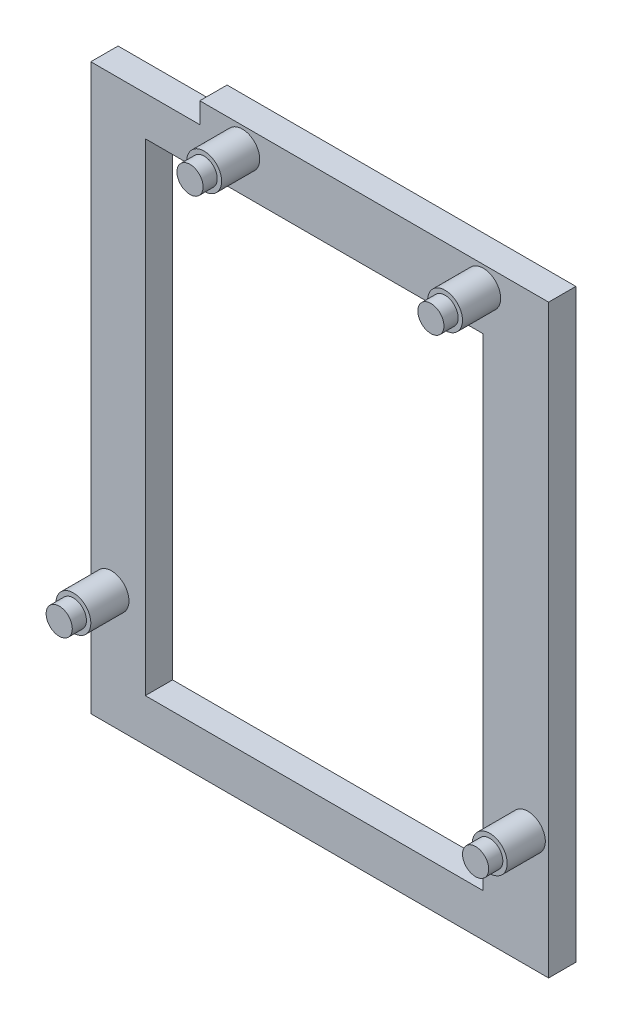
ISO-10303-21;
HEADER;
FILE_DESCRIPTION(('STEP AP214'),'2;1');
FILE_NAME('part.step','',(''),(''),'','','');
FILE_SCHEMA(('AUTOMOTIVE_DESIGN { 1 0 10303 214 1 1 1 1 }'));
ENDSEC;
DATA;
#1=APPLICATION_CONTEXT('core data for automotive mechanical design processes');
#2=APPLICATION_PROTOCOL_DEFINITION('international standard','automotive_design',2000,#1);
#3=PRODUCT_CONTEXT('',#1,'mechanical');
#4=PRODUCT('Part','Part','',(#3));
#5=PRODUCT_RELATED_PRODUCT_CATEGORY('part','',(#4));
#6=PRODUCT_DEFINITION_FORMATION('','',#4);
#7=PRODUCT_DEFINITION_CONTEXT('part definition',#1,'design');
#8=PRODUCT_DEFINITION('design','',#6,#7);
#9=PRODUCT_DEFINITION_SHAPE('','',#8);
#10=(LENGTH_UNIT() NAMED_UNIT(*) SI_UNIT(.MILLI.,.METRE.));
#11=(NAMED_UNIT(*) PLANE_ANGLE_UNIT() SI_UNIT($,.RADIAN.));
#12=(NAMED_UNIT(*) SI_UNIT($,.STERADIAN.) SOLID_ANGLE_UNIT());
#13=UNCERTAINTY_MEASURE_WITH_UNIT(LENGTH_MEASURE(1.E-05),#10,'distance_accuracy_value','');
#14=(GEOMETRIC_REPRESENTATION_CONTEXT(3) GLOBAL_UNCERTAINTY_ASSIGNED_CONTEXT((#13)) GLOBAL_UNIT_ASSIGNED_CONTEXT((#10,
#11,#12)) REPRESENTATION_CONTEXT('',''));
#15=CARTESIAN_POINT('',(0.,0.,0.));
#16=DIRECTION('',(0.,0.,1.));
#17=DIRECTION('',(1.,0.,0.));
#18=AXIS2_PLACEMENT_3D('',#15,#16,#17);
#19=CARTESIAN_POINT('',(45.72,-33.3860882647751,3.175));
#20=DIRECTION('',(1.,0.,0.));
#21=DIRECTION('',(0.,0.,-1.));
#22=AXIS2_PLACEMENT_3D('',#19,#20,#21);
#23=PLANE('',#22);
#24=DIRECTION('',(0.,-1.,0.));
#25=VECTOR('',#24,1.);
#26=CARTESIAN_POINT('',(45.72,-33.3860882647751,0.));
#27=LINE('',#26,#25);
#28=CARTESIAN_POINT('',(45.72,61.1908522999428,0.));
#29=VERTEX_POINT('',#28);
#30=CARTESIAN_POINT('',(45.72,4.99653440010306,0.));
#31=VERTEX_POINT('',#30);
#32=EDGE_CURVE('E153',#29,#31,#27,.T.);
#33=ORIENTED_EDGE('',*,*,#32,.T.);
#34=DIRECTION('',(0.,0.,-1.));
#35=VECTOR('',#34,1.);
#36=CARTESIAN_POINT('',(45.72,4.99653440010306,3.175));
#37=LINE('',#36,#35);
#38=CARTESIAN_POINT('',(45.72,4.99653440010306,3.175));
#39=VERTEX_POINT('',#38);
#40=EDGE_CURVE('E88',#39,#31,#37,.T.);
#41=ORIENTED_EDGE('',*,*,#40,.F.);
#42=DIRECTION('',(0.,-1.,0.));
#43=VECTOR('',#42,1.);
#44=CARTESIAN_POINT('',(45.72,-33.3860882647751,3.175));
#45=LINE('',#44,#43);
#46=CARTESIAN_POINT('',(45.72,61.1908522999428,3.175));
#47=VERTEX_POINT('',#46);
#48=EDGE_CURVE('E53',#47,#39,#45,.T.);
#49=ORIENTED_EDGE('',*,*,#48,.F.);
#50=DIRECTION('',(0.,0.,1.));
#51=VECTOR('',#50,1.);
#52=CARTESIAN_POINT('',(45.72,61.1908522999428,-6.096));
#53=LINE('',#52,#51);
#54=EDGE_CURVE('E190',#29,#47,#53,.T.);
#55=ORIENTED_EDGE('',*,*,#54,.F.);
#56=EDGE_LOOP('',(#33,#41,#49,#55));
#57=FACE_BOUND('',#56,.T.);
#58=ADVANCED_FACE('F36',(#57),#23,.F.);
#59=CARTESIAN_POINT('',(26.67,4.99653440010306,3.175));
#60=DIRECTION('',(0.,1.,0.));
#61=DIRECTION('',(0.,0.,1.));
#62=AXIS2_PLACEMENT_3D('',#59,#60,#61);
#63=PLANE('',#62);
#64=DIRECTION('',(1.,0.,0.));
#65=VECTOR('',#64,1.);
#66=CARTESIAN_POINT('',(26.67,4.99653440010306,0.));
#67=LINE('',#66,#65);
#68=CARTESIAN_POINT('',(6.35,4.99653440010306,0.));
#69=VERTEX_POINT('',#68);
#70=EDGE_CURVE('E155',#69,#31,#67,.T.);
#71=ORIENTED_EDGE('',*,*,#70,.F.);
#72=DIRECTION('',(0.,0.,1.));
#73=VECTOR('',#72,1.);
#74=CARTESIAN_POINT('',(6.35,4.99653440010306,-6.096));
#75=LINE('',#74,#73);
#76=CARTESIAN_POINT('',(6.35,4.99653440010306,3.175));
#77=VERTEX_POINT('',#76);
#78=EDGE_CURVE('E179',#69,#77,#75,.T.);
#79=ORIENTED_EDGE('',*,*,#78,.T.);
#80=DIRECTION('',(1.,0.,0.));
#81=VECTOR('',#80,1.);
#82=CARTESIAN_POINT('',(26.67,4.99653440010306,3.175));
#83=LINE('',#82,#81);
#84=EDGE_CURVE('E135',#77,#39,#83,.T.);
#85=ORIENTED_EDGE('',*,*,#84,.T.);
#86=ORIENTED_EDGE('',*,*,#40,.T.);
#87=EDGE_LOOP('',(#71,#79,#85,#86));
#88=FACE_BOUND('',#87,.T.);
#89=ADVANCED_FACE('F261',(#88),#63,.T.);
#90=CARTESIAN_POINT('',(53.34,-33.3860882647751,3.175));
#91=DIRECTION('',(1.,0.,0.));
#92=DIRECTION('',(0.,0.,-1.));
#93=AXIS2_PLACEMENT_3D('',#90,#91,#92);
#94=PLANE('',#93);
#95=DIRECTION('',(0.,-1.,0.));
#96=VECTOR('',#95,1.);
#97=CARTESIAN_POINT('',(53.34,-33.3860882647751,0.));
#98=LINE('',#97,#96);
#99=CARTESIAN_POINT('',(53.34,68.199,0.));
#100=VERTEX_POINT('',#99);
#101=CARTESIAN_POINT('',(53.34,0.,0.));
#102=VERTEX_POINT('',#101);
#103=EDGE_CURVE('E137',#100,#102,#98,.T.);
#104=ORIENTED_EDGE('',*,*,#103,.F.);
#105=DIRECTION('',(0.,0.,-1.));
#106=VECTOR('',#105,1.);
#107=CARTESIAN_POINT('',(53.34,68.199,3.175));
#108=LINE('',#107,#106);
#109=CARTESIAN_POINT('',(53.34,68.199,3.175));
#110=VERTEX_POINT('',#109);
#111=EDGE_CURVE('E93',#110,#100,#108,.T.);
#112=ORIENTED_EDGE('',*,*,#111,.F.);
#113=DIRECTION('',(0.,-1.,0.));
#114=VECTOR('',#113,1.);
#115=CARTESIAN_POINT('',(53.34,-33.3860882647751,3.175));
#116=LINE('',#115,#114);
#117=CARTESIAN_POINT('',(53.34,0.,3.175));
#118=VERTEX_POINT('',#117);
#119=EDGE_CURVE('E245',#110,#118,#116,.T.);
#120=ORIENTED_EDGE('',*,*,#119,.T.);
#121=DIRECTION('',(0.,0.,-1.));
#122=VECTOR('',#121,1.);
#123=CARTESIAN_POINT('',(53.34,0.,3.175));
#124=LINE('',#123,#122);
#125=EDGE_CURVE('E81',#118,#102,#124,.T.);
#126=ORIENTED_EDGE('',*,*,#125,.T.);
#127=EDGE_LOOP('',(#104,#112,#120,#126));
#128=FACE_BOUND('',#127,.T.);
#129=ADVANCED_FACE('F38',(#128),#94,.T.);
#130=CARTESIAN_POINT('',(26.67,68.199,3.175));
#131=DIRECTION('',(0.,1.,0.));
#132=DIRECTION('',(0.,0.,1.));
#133=AXIS2_PLACEMENT_3D('',#130,#131,#132);
#134=PLANE('',#133);
#135=DIRECTION('',(1.,0.,0.));
#136=VECTOR('',#135,1.);
#137=CARTESIAN_POINT('',(26.67,68.199,0.));
#138=LINE('',#137,#136);
#139=CARTESIAN_POINT('',(12.7,68.199,0.));
#140=VERTEX_POINT('',#139);
#141=EDGE_CURVE('E140',#140,#100,#138,.T.);
#142=ORIENTED_EDGE('',*,*,#141,.F.);
#143=DIRECTION('',(0.,0.,-1.));
#144=VECTOR('',#143,1.);
#145=CARTESIAN_POINT('',(12.7,68.199,3.175));
#146=LINE('',#145,#144);
#147=CARTESIAN_POINT('',(12.7,68.199,3.175));
#148=VERTEX_POINT('',#147);
#149=EDGE_CURVE('E164',#148,#140,#146,.T.);
#150=ORIENTED_EDGE('',*,*,#149,.F.);
#151=DIRECTION('',(1.,0.,0.));
#152=VECTOR('',#151,1.);
#153=CARTESIAN_POINT('',(26.67,68.199,3.175));
#154=LINE('',#153,#152);
#155=EDGE_CURVE('E247',#148,#110,#154,.T.);
#156=ORIENTED_EDGE('',*,*,#155,.T.);
#157=ORIENTED_EDGE('',*,*,#111,.T.);
#158=EDGE_LOOP('',(#142,#150,#156,#157));
#159=FACE_BOUND('',#158,.T.);
#160=ADVANCED_FACE('F260',(#159),#134,.T.);
#161=CARTESIAN_POINT('',(12.7,-33.3860882647751,3.175));
#162=DIRECTION('',(-1.,0.,0.));
#163=DIRECTION('',(0.,0.,1.));
#164=AXIS2_PLACEMENT_3D('',#161,#162,#163);
#165=PLANE('',#164);
#166=DIRECTION('',(0.,1.,0.));
#167=VECTOR('',#166,1.);
#168=CARTESIAN_POINT('',(12.7,-33.3860882647751,0.));
#169=LINE('',#168,#167);
#170=CARTESIAN_POINT('',(12.7,65.786,0.));
#171=VERTEX_POINT('',#170);
#172=EDGE_CURVE('E144',#171,#140,#169,.T.);
#173=ORIENTED_EDGE('',*,*,#172,.F.);
#174=DIRECTION('',(0.,0.,-1.));
#175=VECTOR('',#174,1.);
#176=CARTESIAN_POINT('',(12.7,65.786,3.175));
#177=LINE('',#176,#175);
#178=CARTESIAN_POINT('',(12.7,65.786,3.175));
#179=VERTEX_POINT('',#178);
#180=EDGE_CURVE('E162',#179,#171,#177,.T.);
#181=ORIENTED_EDGE('',*,*,#180,.F.);
#182=DIRECTION('',(0.,1.,0.));
#183=VECTOR('',#182,1.);
#184=CARTESIAN_POINT('',(12.7,-33.3860882647751,3.175));
#185=LINE('',#184,#183);
#186=EDGE_CURVE('E130',#179,#148,#185,.T.);
#187=ORIENTED_EDGE('',*,*,#186,.T.);
#188=ORIENTED_EDGE('',*,*,#149,.T.);
#189=EDGE_LOOP('',(#173,#181,#187,#188));
#190=FACE_BOUND('',#189,.T.);
#191=ADVANCED_FACE('F252',(#190),#165,.T.);
#192=CARTESIAN_POINT('',(26.67,65.786,3.175));
#193=DIRECTION('',(0.,1.,0.));
#194=DIRECTION('',(0.,0.,1.));
#195=AXIS2_PLACEMENT_3D('',#192,#193,#194);
#196=PLANE('',#195);
#197=DIRECTION('',(1.,0.,0.));
#198=VECTOR('',#197,1.);
#199=CARTESIAN_POINT('',(26.67,65.786,0.));
#200=LINE('',#199,#198);
#201=CARTESIAN_POINT('',(0.,65.786,0.));
#202=VERTEX_POINT('',#201);
#203=EDGE_CURVE('E147',#202,#171,#200,.T.);
#204=ORIENTED_EDGE('',*,*,#203,.F.);
#205=DIRECTION('',(0.,0.,-1.));
#206=VECTOR('',#205,1.);
#207=CARTESIAN_POINT('',(0.,65.786,3.175));
#208=LINE('',#207,#206);
#209=CARTESIAN_POINT('',(0.,65.786,3.175));
#210=VERTEX_POINT('',#209);
#211=EDGE_CURVE('E118',#210,#202,#208,.T.);
#212=ORIENTED_EDGE('',*,*,#211,.F.);
#213=DIRECTION('',(1.,0.,0.));
#214=VECTOR('',#213,1.);
#215=CARTESIAN_POINT('',(26.67,65.786,3.175));
#216=LINE('',#215,#214);
#217=EDGE_CURVE('E128',#210,#179,#216,.T.);
#218=ORIENTED_EDGE('',*,*,#217,.T.);
#219=ORIENTED_EDGE('',*,*,#180,.T.);
#220=EDGE_LOOP('',(#204,#212,#218,#219));
#221=FACE_BOUND('',#220,.T.);
#222=ADVANCED_FACE('F257',(#221),#196,.T.);
#223=CARTESIAN_POINT('',(0.,-33.3860882647751,3.175));
#224=DIRECTION('',(-1.,0.,0.));
#225=DIRECTION('',(0.,0.,1.));
#226=AXIS2_PLACEMENT_3D('',#223,#224,#225);
#227=PLANE('',#226);
#228=DIRECTION('',(0.,1.,0.));
#229=VECTOR('',#228,1.);
#230=CARTESIAN_POINT('',(0.,-33.3860882647751,0.));
#231=LINE('',#230,#229);
#232=CARTESIAN_POINT('',(0.,0.,0.));
#233=VERTEX_POINT('',#232);
#234=EDGE_CURVE('E115',#233,#202,#231,.T.);
#235=ORIENTED_EDGE('',*,*,#234,.F.);
#236=DIRECTION('',(0.,0.,-1.));
#237=VECTOR('',#236,1.);
#238=CARTESIAN_POINT('',(0.,0.,3.175));
#239=LINE('',#238,#237);
#240=CARTESIAN_POINT('',(0.,0.,3.175));
#241=VERTEX_POINT('',#240);
#242=EDGE_CURVE('E109',#241,#233,#239,.T.);
#243=ORIENTED_EDGE('',*,*,#242,.F.);
#244=DIRECTION('',(0.,1.,0.));
#245=VECTOR('',#244,1.);
#246=CARTESIAN_POINT('',(0.,-33.3860882647751,3.175));
#247=LINE('',#246,#245);
#248=EDGE_CURVE('E113',#241,#210,#247,.T.);
#249=ORIENTED_EDGE('',*,*,#248,.T.);
#250=ORIENTED_EDGE('',*,*,#211,.T.);
#251=EDGE_LOOP('',(#235,#243,#249,#250));
#252=FACE_BOUND('',#251,.T.);
#253=ADVANCED_FACE('F111',(#252),#227,.T.);
#254=CARTESIAN_POINT('',(26.67,0.,3.175));
#255=DIRECTION('',(0.,1.,0.));
#256=DIRECTION('',(0.,0.,1.));
#257=AXIS2_PLACEMENT_3D('',#254,#255,#256);
#258=PLANE('',#257);
#259=DIRECTION('',(1.,0.,0.));
#260=VECTOR('',#259,1.);
#261=CARTESIAN_POINT('',(26.67,0.,0.));
#262=LINE('',#261,#260);
#263=EDGE_CURVE('E151',#233,#102,#262,.T.);
#264=ORIENTED_EDGE('',*,*,#263,.T.);
#265=ORIENTED_EDGE('',*,*,#125,.F.);
#266=DIRECTION('',(1.,0.,0.));
#267=VECTOR('',#266,1.);
#268=CARTESIAN_POINT('',(26.67,0.,3.175));
#269=LINE('',#268,#267);
#270=EDGE_CURVE('E120',#241,#118,#269,.T.);
#271=ORIENTED_EDGE('',*,*,#270,.F.);
#272=ORIENTED_EDGE('',*,*,#242,.T.);
#273=EDGE_LOOP('',(#264,#265,#271,#272));
#274=FACE_BOUND('',#273,.T.);
#275=ADVANCED_FACE('F121',(#274),#258,.F.);
#276=CARTESIAN_POINT('',(26.67,-33.3860882647751,3.175));
#277=DIRECTION('',(0.,0.,1.));
#278=DIRECTION('',(1.,0.,0.));
#279=AXIS2_PLACEMENT_3D('',#276,#277,#278);
#280=PLANE('',#279);
#281=DIRECTION('',(-1.,0.,0.));
#282=VECTOR('',#281,1.);
#283=CARTESIAN_POINT('',(26.67,61.1908522999428,3.175));
#284=LINE('',#283,#282);
#285=CARTESIAN_POINT('',(6.35,61.1908522999428,3.175));
#286=VERTEX_POINT('',#285);
#287=EDGE_CURVE('E187',#47,#286,#284,.T.);
#288=ORIENTED_EDGE('',*,*,#287,.F.);
#289=ORIENTED_EDGE('',*,*,#48,.T.);
#290=ORIENTED_EDGE('',*,*,#84,.F.);
#291=DIRECTION('',(0.,1.,0.));
#292=VECTOR('',#291,1.);
#293=CARTESIAN_POINT('',(6.35,-33.3860882647751,3.175));
#294=LINE('',#293,#292);
#295=EDGE_CURVE('E587',#77,#286,#294,.T.);
#296=ORIENTED_EDGE('',*,*,#295,.T.);
#297=EDGE_LOOP('',(#288,#289,#290,#296));
#298=FACE_BOUND('',#297,.T.);
#299=CARTESIAN_POINT('',(45.72,65.786,3.175));
#300=DIRECTION('',(0.,0.,1.));
#301=DIRECTION('',(1.,0.,0.));
#302=AXIS2_PLACEMENT_3D('',#299,#300,#301);
#303=CIRCLE('',#302,2.032);
#304=CARTESIAN_POINT('',(43.688,65.786,3.175));
#305=VERTEX_POINT('',#304);
#306=EDGE_CURVE('E158',#305,#305,#303,.T.);
#307=ORIENTED_EDGE('',*,*,#306,.F.);
#308=EDGE_LOOP('',(#307));
#309=FACE_BOUND('',#308,.T.);
#310=CARTESIAN_POINT('',(17.653,65.786,3.175));
#311=DIRECTION('',(0.,0.,1.));
#312=DIRECTION('',(1.,0.,0.));
#313=AXIS2_PLACEMENT_3D('',#310,#311,#312);
#314=CIRCLE('',#313,2.032);
#315=CARTESIAN_POINT('',(15.621,65.786,3.175));
#316=VERTEX_POINT('',#315);
#317=EDGE_CURVE('E236',#316,#316,#314,.T.);
#318=ORIENTED_EDGE('',*,*,#317,.F.);
#319=EDGE_LOOP('',(#318));
#320=FACE_BOUND('',#319,.T.);
#321=CARTESIAN_POINT('',(2.413,13.589,3.175));
#322=DIRECTION('',(0.,0.,1.));
#323=DIRECTION('',(1.,0.,0.));
#324=AXIS2_PLACEMENT_3D('',#321,#322,#323);
#325=CIRCLE('',#324,2.032);
#326=CARTESIAN_POINT('',(0.381,13.589,3.175));
#327=VERTEX_POINT('',#326);
#328=EDGE_CURVE('E239',#327,#327,#325,.T.);
#329=ORIENTED_EDGE('',*,*,#328,.F.);
#330=EDGE_LOOP('',(#329));
#331=FACE_BOUND('',#330,.T.);
#332=CARTESIAN_POINT('',(50.927,13.589,3.175));
#333=DIRECTION('',(0.,0.,1.));
#334=DIRECTION('',(1.,0.,0.));
#335=AXIS2_PLACEMENT_3D('',#332,#333,#334);
#336=CIRCLE('',#335,2.032);
#337=CARTESIAN_POINT('',(48.895,13.589,3.175));
#338=VERTEX_POINT('',#337);
#339=EDGE_CURVE('E242',#338,#338,#336,.T.);
#340=ORIENTED_EDGE('',*,*,#339,.F.);
#341=EDGE_LOOP('',(#340));
#342=FACE_BOUND('',#341,.T.);
#343=ORIENTED_EDGE('',*,*,#119,.F.);
#344=ORIENTED_EDGE('',*,*,#155,.F.);
#345=ORIENTED_EDGE('',*,*,#186,.F.);
#346=ORIENTED_EDGE('',*,*,#217,.F.);
#347=ORIENTED_EDGE('',*,*,#248,.F.);
#348=ORIENTED_EDGE('',*,*,#270,.T.);
#349=EDGE_LOOP('',(#343,#344,#345,#346,#347,#348));
#350=FACE_BOUND('',#349,.T.);
#351=ADVANCED_FACE('F125',(#298,#309,#320,#331,#342,#350),#280,.T.);
#352=CARTESIAN_POINT('',(26.67,-33.3860882647751,0.));
#353=DIRECTION('',(0.,0.,1.));
#354=DIRECTION('',(1.,0.,0.));
#355=AXIS2_PLACEMENT_3D('',#352,#353,#354);
#356=PLANE('',#355);
#357=ORIENTED_EDGE('',*,*,#103,.T.);
#358=ORIENTED_EDGE('',*,*,#263,.F.);
#359=ORIENTED_EDGE('',*,*,#234,.T.);
#360=ORIENTED_EDGE('',*,*,#203,.T.);
#361=ORIENTED_EDGE('',*,*,#172,.T.);
#362=ORIENTED_EDGE('',*,*,#141,.T.);
#363=EDGE_LOOP('',(#357,#358,#359,#360,#361,#362));
#364=FACE_BOUND('',#363,.T.);
#365=ORIENTED_EDGE('',*,*,#32,.F.);
#366=DIRECTION('',(-1.,0.,0.));
#367=VECTOR('',#366,1.);
#368=CARTESIAN_POINT('',(26.67,61.1908522999428,0.));
#369=LINE('',#368,#367);
#370=CARTESIAN_POINT('',(6.35,61.1908522999428,0.));
#371=VERTEX_POINT('',#370);
#372=EDGE_CURVE('E11',#29,#371,#369,.T.);
#373=ORIENTED_EDGE('',*,*,#372,.T.);
#374=DIRECTION('',(0.,1.,0.));
#375=VECTOR('',#374,1.);
#376=CARTESIAN_POINT('',(6.35,-33.3860882647751,0.));
#377=LINE('',#376,#375);
#378=EDGE_CURVE('E45',#69,#371,#377,.T.);
#379=ORIENTED_EDGE('',*,*,#378,.F.);
#380=ORIENTED_EDGE('',*,*,#70,.T.);
#381=EDGE_LOOP('',(#365,#373,#379,#380));
#382=FACE_BOUND('',#381,.T.);
#383=ADVANCED_FACE('F193',(#364,#382),#356,.F.);
#384=CARTESIAN_POINT('',(17.653,65.786,7.62));
#385=DIRECTION('',(0.,0.,-1.));
#386=DIRECTION('',(-1.,0.,0.));
#387=AXIS2_PLACEMENT_3D('',#384,#385,#386);
#388=CYLINDRICAL_SURFACE('',#387,2.032);
#389=CARTESIAN_POINT('',(17.653,65.786,7.62));
#390=DIRECTION('',(0.,0.,1.));
#391=DIRECTION('',(1.,0.,0.));
#392=AXIS2_PLACEMENT_3D('',#389,#390,#391);
#393=CIRCLE('',#392,2.032);
#394=CARTESIAN_POINT('',(15.621,65.786,7.62));
#395=VERTEX_POINT('',#394);
#396=EDGE_CURVE('E141',#395,#395,#393,.T.);
#397=CARTESIAN_POINT('',(15.621,65.786,3.175));
#398=CARTESIAN_POINT('',(15.621,65.786,3.22130208333333));
#399=CARTESIAN_POINT('',(15.621,65.786,3.26760416666667));
#400=CARTESIAN_POINT('',(15.621,65.786,3.36020833333333));
#401=CARTESIAN_POINT('',(15.621,65.786,3.40651041666667));
#402=CARTESIAN_POINT('',(15.621,65.786,3.49911458333333));
#403=CARTESIAN_POINT('',(15.621,65.786,3.54541666666667));
#404=CARTESIAN_POINT('',(15.621,65.786,3.63802083333333));
#405=CARTESIAN_POINT('',(15.621,65.786,3.68432291666667));
#406=CARTESIAN_POINT('',(15.621,65.786,3.77692708333333));
#407=CARTESIAN_POINT('',(15.621,65.786,3.82322916666667));
#408=CARTESIAN_POINT('',(15.621,65.786,3.91583333333333));
#409=CARTESIAN_POINT('',(15.621,65.786,3.96213541666667));
#410=CARTESIAN_POINT('',(15.621,65.786,4.05473958333333));
#411=CARTESIAN_POINT('',(15.621,65.786,4.10104166666667));
#412=CARTESIAN_POINT('',(15.621,65.786,4.19364583333333));
#413=CARTESIAN_POINT('',(15.621,65.786,4.23994791666667));
#414=CARTESIAN_POINT('',(15.621,65.786,4.33255208333333));
#415=CARTESIAN_POINT('',(15.621,65.786,4.37885416666667));
#416=CARTESIAN_POINT('',(15.621,65.786,4.47145833333333));
#417=CARTESIAN_POINT('',(15.621,65.786,4.51776041666667));
#418=CARTESIAN_POINT('',(15.621,65.786,4.61036458333333));
#419=CARTESIAN_POINT('',(15.621,65.786,4.65666666666666));
#420=CARTESIAN_POINT('',(15.621,65.786,4.74927083333333));
#421=CARTESIAN_POINT('',(15.621,65.786,4.79557291666667));
#422=CARTESIAN_POINT('',(15.621,65.786,4.88817708333333));
#423=CARTESIAN_POINT('',(15.621,65.786,4.93447916666666));
#424=CARTESIAN_POINT('',(15.621,65.786,5.02708333333333));
#425=CARTESIAN_POINT('',(15.621,65.786,5.07338541666667));
#426=CARTESIAN_POINT('',(15.621,65.786,5.16598958333333));
#427=CARTESIAN_POINT('',(15.621,65.786,5.21229166666667));
#428=CARTESIAN_POINT('',(15.621,65.786,5.30489583333333));
#429=CARTESIAN_POINT('',(15.621,65.786,5.35119791666667));
#430=CARTESIAN_POINT('',(15.621,65.786,5.44380208333333));
#431=CARTESIAN_POINT('',(15.621,65.786,5.49010416666667));
#432=CARTESIAN_POINT('',(15.621,65.786,5.58270833333333));
#433=CARTESIAN_POINT('',(15.621,65.786,5.62901041666666));
#434=CARTESIAN_POINT('',(15.621,65.786,5.72161458333333));
#435=CARTESIAN_POINT('',(15.621,65.786,5.76791666666667));
#436=CARTESIAN_POINT('',(15.621,65.786,5.86052083333333));
#437=CARTESIAN_POINT('',(15.621,65.786,5.90682291666667));
#438=CARTESIAN_POINT('',(15.621,65.786,5.99942708333333));
#439=CARTESIAN_POINT('',(15.621,65.786,6.04572916666667));
#440=CARTESIAN_POINT('',(15.621,65.786,6.13833333333333));
#441=CARTESIAN_POINT('',(15.621,65.786,6.18463541666667));
#442=CARTESIAN_POINT('',(15.621,65.786,6.27723958333333));
#443=CARTESIAN_POINT('',(15.621,65.786,6.32354166666667));
#444=CARTESIAN_POINT('',(15.621,65.786,6.41614583333333));
#445=CARTESIAN_POINT('',(15.621,65.786,6.46244791666667));
#446=CARTESIAN_POINT('',(15.621,65.786,6.55505208333333));
#447=CARTESIAN_POINT('',(15.621,65.786,6.60135416666667));
#448=CARTESIAN_POINT('',(15.621,65.786,6.69395833333333));
#449=CARTESIAN_POINT('',(15.621,65.786,6.74026041666666));
#450=CARTESIAN_POINT('',(15.621,65.786,6.83286458333333));
#451=CARTESIAN_POINT('',(15.621,65.786,6.87916666666667));
#452=CARTESIAN_POINT('',(15.621,65.786,6.97177083333333));
#453=CARTESIAN_POINT('',(15.621,65.786,7.01807291666667));
#454=CARTESIAN_POINT('',(15.621,65.786,7.11067708333333));
#455=CARTESIAN_POINT('',(15.621,65.786,7.15697916666667));
#456=CARTESIAN_POINT('',(15.621,65.786,7.24958333333333));
#457=CARTESIAN_POINT('',(15.621,65.786,7.29588541666666));
#458=CARTESIAN_POINT('',(15.621,65.786,7.38848958333333));
#459=CARTESIAN_POINT('',(15.621,65.786,7.43479166666666));
#460=CARTESIAN_POINT('',(15.621,65.786,7.52739583333333));
#461=CARTESIAN_POINT('',(15.621,65.786,7.57369791666667));
#462=CARTESIAN_POINT('',(15.621,65.786,7.62));
#463=B_SPLINE_CURVE_WITH_KNOTS('',3,(#397,#398,#399,#400,#401,#402,#403,#404,#405,#406,#407,
#408,#409,#410,#411,#412,#413,#414,#415,#416,#417,#418,#419,#420,#421,#422,#423,#424,#425,#426,
#427,#428,#429,#430,#431,#432,#433,#434,#435,#436,#437,#438,#439,#440,#441,#442,#443,#444,#445,
#446,#447,#448,#449,#450,#451,#452,#453,#454,#455,#456,#457,#458,#459,#460,#461,#462),
.UNSPECIFIED.,.F.,.F.,(4,2,2,2,2,2,2,2,2,2,2,2,2,2,2,2,2,2,2,2,2,2,2,2,2,2,2,2,2,2,2,2,4),(0.,
0.13890625,0.2778125,0.41671875,0.555625,0.694531249999999,0.833437499999999,0.97234375,1.11125,
1.25015625,1.3890625,1.52796875,1.666875,1.80578125,1.9446875,2.08359375,2.2225,2.36140625,
2.5003125,2.63921875,2.778125,2.91703125,3.0559375,3.19484375,3.33375,3.47265625,3.6115625,
3.75046875,3.889375,4.02828125,4.1671875,4.30609375,4.445),.UNSPECIFIED.);
#464=EDGE_CURVE('BSEAM311',#316,#395,#463,.T.);
#465=ORIENTED_EDGE('',*,*,#317,.T.);
#466=ORIENTED_EDGE('',*,*,#396,.F.);
#467=ORIENTED_EDGE('',*,*,#464,.T.);
#468=ORIENTED_EDGE('',*,*,#464,.F.);
#469=EDGE_LOOP('',(#465,#467,#466,#468));
#470=FACE_BOUND('',#469,.T.);
#471=ADVANCED_FACE('F311',(#470),#388,.T.);
#472=CARTESIAN_POINT('',(26.67,-33.3860882647751,7.62));
#473=DIRECTION('',(0.,0.,1.));
#474=DIRECTION('',(1.,0.,0.));
#475=AXIS2_PLACEMENT_3D('',#472,#473,#474);
#476=PLANE('',#475);
#477=CARTESIAN_POINT('',(17.653,65.786,7.62));
#478=DIRECTION('',(0.,0.,1.));
#479=DIRECTION('',(1.,0.,0.));
#480=AXIS2_PLACEMENT_3D('',#477,#478,#479);
#481=CIRCLE('',#480,1.524);
#482=CARTESIAN_POINT('',(19.177,65.786,7.62));
#483=VERTEX_POINT('',#482);
#484=EDGE_CURVE('E229',#483,#483,#481,.T.);
#485=ORIENTED_EDGE('',*,*,#484,.F.);
#486=EDGE_LOOP('',(#485));
#487=FACE_BOUND('',#486,.T.);
#488=ORIENTED_EDGE('',*,*,#396,.T.);
#489=EDGE_LOOP('',(#488));
#490=FACE_BOUND('',#489,.T.);
#491=ADVANCED_FACE('F317',(#487,#490),#476,.T.);
#492=CARTESIAN_POINT('',(45.72,65.786,7.62));
#493=DIRECTION('',(0.,0.,-1.));
#494=DIRECTION('',(-1.,0.,0.));
#495=AXIS2_PLACEMENT_3D('',#492,#493,#494);
#496=CYLINDRICAL_SURFACE('',#495,2.032);
#497=CARTESIAN_POINT('',(45.72,65.786,7.62));
#498=DIRECTION('',(0.,0.,1.));
#499=DIRECTION('',(1.,0.,0.));
#500=AXIS2_PLACEMENT_3D('',#497,#498,#499);
#501=CIRCLE('',#500,2.032);
#502=CARTESIAN_POINT('',(43.688,65.786,7.62));
#503=VERTEX_POINT('',#502);
#504=EDGE_CURVE('E226',#503,#503,#501,.T.);
#505=CARTESIAN_POINT('',(43.688,65.786,3.175));
#506=CARTESIAN_POINT('',(43.688,65.786,3.22130208333333));
#507=CARTESIAN_POINT('',(43.688,65.786,3.26760416666667));
#508=CARTESIAN_POINT('',(43.688,65.786,3.36020833333333));
#509=CARTESIAN_POINT('',(43.688,65.786,3.40651041666667));
#510=CARTESIAN_POINT('',(43.688,65.786,3.49911458333333));
#511=CARTESIAN_POINT('',(43.688,65.786,3.54541666666667));
#512=CARTESIAN_POINT('',(43.688,65.786,3.63802083333333));
#513=CARTESIAN_POINT('',(43.688,65.786,3.68432291666667));
#514=CARTESIAN_POINT('',(43.688,65.786,3.77692708333333));
#515=CARTESIAN_POINT('',(43.688,65.786,3.82322916666667));
#516=CARTESIAN_POINT('',(43.688,65.786,3.91583333333333));
#517=CARTESIAN_POINT('',(43.688,65.786,3.96213541666667));
#518=CARTESIAN_POINT('',(43.688,65.786,4.05473958333333));
#519=CARTESIAN_POINT('',(43.688,65.786,4.10104166666667));
#520=CARTESIAN_POINT('',(43.688,65.786,4.19364583333333));
#521=CARTESIAN_POINT('',(43.688,65.786,4.23994791666667));
#522=CARTESIAN_POINT('',(43.688,65.786,4.33255208333333));
#523=CARTESIAN_POINT('',(43.688,65.786,4.37885416666667));
#524=CARTESIAN_POINT('',(43.688,65.786,4.47145833333333));
#525=CARTESIAN_POINT('',(43.688,65.786,4.51776041666667));
#526=CARTESIAN_POINT('',(43.688,65.786,4.61036458333333));
#527=CARTESIAN_POINT('',(43.688,65.786,4.65666666666666));
#528=CARTESIAN_POINT('',(43.688,65.786,4.74927083333333));
#529=CARTESIAN_POINT('',(43.688,65.786,4.79557291666667));
#530=CARTESIAN_POINT('',(43.688,65.786,4.88817708333333));
#531=CARTESIAN_POINT('',(43.688,65.786,4.93447916666666));
#532=CARTESIAN_POINT('',(43.688,65.786,5.02708333333333));
#533=CARTESIAN_POINT('',(43.688,65.786,5.07338541666667));
#534=CARTESIAN_POINT('',(43.688,65.786,5.16598958333333));
#535=CARTESIAN_POINT('',(43.688,65.786,5.21229166666667));
#536=CARTESIAN_POINT('',(43.688,65.786,5.30489583333333));
#537=CARTESIAN_POINT('',(43.688,65.786,5.35119791666667));
#538=CARTESIAN_POINT('',(43.688,65.786,5.44380208333333));
#539=CARTESIAN_POINT('',(43.688,65.786,5.49010416666667));
#540=CARTESIAN_POINT('',(43.688,65.786,5.58270833333333));
#541=CARTESIAN_POINT('',(43.688,65.786,5.62901041666666));
#542=CARTESIAN_POINT('',(43.688,65.786,5.72161458333333));
#543=CARTESIAN_POINT('',(43.688,65.786,5.76791666666667));
#544=CARTESIAN_POINT('',(43.688,65.786,5.86052083333333));
#545=CARTESIAN_POINT('',(43.688,65.786,5.90682291666667));
#546=CARTESIAN_POINT('',(43.688,65.786,5.99942708333333));
#547=CARTESIAN_POINT('',(43.688,65.786,6.04572916666667));
#548=CARTESIAN_POINT('',(43.688,65.786,6.13833333333333));
#549=CARTESIAN_POINT('',(43.688,65.786,6.18463541666667));
#550=CARTESIAN_POINT('',(43.688,65.786,6.27723958333333));
#551=CARTESIAN_POINT('',(43.688,65.786,6.32354166666667));
#552=CARTESIAN_POINT('',(43.688,65.786,6.41614583333333));
#553=CARTESIAN_POINT('',(43.688,65.786,6.46244791666667));
#554=CARTESIAN_POINT('',(43.688,65.786,6.55505208333333));
#555=CARTESIAN_POINT('',(43.688,65.786,6.60135416666667));
#556=CARTESIAN_POINT('',(43.688,65.786,6.69395833333333));
#557=CARTESIAN_POINT('',(43.688,65.786,6.74026041666666));
#558=CARTESIAN_POINT('',(43.688,65.786,6.83286458333333));
#559=CARTESIAN_POINT('',(43.688,65.786,6.87916666666667));
#560=CARTESIAN_POINT('',(43.688,65.786,6.97177083333333));
#561=CARTESIAN_POINT('',(43.688,65.786,7.01807291666667));
#562=CARTESIAN_POINT('',(43.688,65.786,7.11067708333333));
#563=CARTESIAN_POINT('',(43.688,65.786,7.15697916666667));
#564=CARTESIAN_POINT('',(43.688,65.786,7.24958333333333));
#565=CARTESIAN_POINT('',(43.688,65.786,7.29588541666666));
#566=CARTESIAN_POINT('',(43.688,65.786,7.38848958333333));
#567=CARTESIAN_POINT('',(43.688,65.786,7.43479166666666));
#568=CARTESIAN_POINT('',(43.688,65.786,7.52739583333333));
#569=CARTESIAN_POINT('',(43.688,65.786,7.57369791666667));
#570=CARTESIAN_POINT('',(43.688,65.786,7.62));
#571=B_SPLINE_CURVE_WITH_KNOTS('',3,(#505,#506,#507,#508,#509,#510,#511,#512,#513,#514,#515,
#516,#517,#518,#519,#520,#521,#522,#523,#524,#525,#526,#527,#528,#529,#530,#531,#532,#533,#534,
#535,#536,#537,#538,#539,#540,#541,#542,#543,#544,#545,#546,#547,#548,#549,#550,#551,#552,#553,
#554,#555,#556,#557,#558,#559,#560,#561,#562,#563,#564,#565,#566,#567,#568,#569,#570),
.UNSPECIFIED.,.F.,.F.,(4,2,2,2,2,2,2,2,2,2,2,2,2,2,2,2,2,2,2,2,2,2,2,2,2,2,2,2,2,2,2,2,4),(0.,
0.13890625,0.2778125,0.41671875,0.555625,0.694531249999999,0.833437499999999,0.97234375,1.11125,
1.25015625,1.3890625,1.52796875,1.666875,1.80578125,1.9446875,2.08359375,2.2225,2.36140625,
2.5003125,2.63921875,2.778125,2.91703125,3.0559375,3.19484375,3.33375,3.47265625,3.6115625,
3.75046875,3.889375,4.02828125,4.1671875,4.30609375,4.445),.UNSPECIFIED.);
#572=EDGE_CURVE('BSEAM325',#305,#503,#571,.T.);
#573=ORIENTED_EDGE('',*,*,#306,.T.);
#574=ORIENTED_EDGE('',*,*,#504,.F.);
#575=ORIENTED_EDGE('',*,*,#572,.T.);
#576=ORIENTED_EDGE('',*,*,#572,.F.);
#577=EDGE_LOOP('',(#573,#575,#574,#576));
#578=FACE_BOUND('',#577,.T.);
#579=ADVANCED_FACE('F325',(#578),#496,.T.);
#580=CARTESIAN_POINT('',(26.67,-33.3860882647751,7.62));
#581=DIRECTION('',(0.,0.,1.));
#582=DIRECTION('',(1.,0.,0.));
#583=AXIS2_PLACEMENT_3D('',#580,#581,#582);
#584=PLANE('',#583);
#585=CARTESIAN_POINT('',(45.72,65.786,7.62));
#586=DIRECTION('',(0.,0.,1.));
#587=DIRECTION('',(1.,0.,0.));
#588=AXIS2_PLACEMENT_3D('',#585,#586,#587);
#589=CIRCLE('',#588,1.524);
#590=CARTESIAN_POINT('',(47.244,65.786,7.62));
#591=VERTEX_POINT('',#590);
#592=EDGE_CURVE('E223',#591,#591,#589,.T.);
#593=ORIENTED_EDGE('',*,*,#592,.F.);
#594=EDGE_LOOP('',(#593));
#595=FACE_BOUND('',#594,.T.);
#596=ORIENTED_EDGE('',*,*,#504,.T.);
#597=EDGE_LOOP('',(#596));
#598=FACE_BOUND('',#597,.T.);
#599=ADVANCED_FACE('F333',(#595,#598),#584,.T.);
#600=CARTESIAN_POINT('',(50.927,13.589,7.62));
#601=DIRECTION('',(0.,0.,-1.));
#602=DIRECTION('',(-1.,0.,0.));
#603=AXIS2_PLACEMENT_3D('',#600,#601,#602);
#604=CYLINDRICAL_SURFACE('',#603,2.032);
#605=CARTESIAN_POINT('',(50.927,13.589,7.62));
#606=DIRECTION('',(0.,0.,1.));
#607=DIRECTION('',(1.,0.,0.));
#608=AXIS2_PLACEMENT_3D('',#605,#606,#607);
#609=CIRCLE('',#608,2.032);
#610=CARTESIAN_POINT('',(48.895,13.589,7.62));
#611=VERTEX_POINT('',#610);
#612=EDGE_CURVE('E220',#611,#611,#609,.T.);
#613=CARTESIAN_POINT('',(48.895,13.589,3.175));
#614=CARTESIAN_POINT('',(48.895,13.589,3.22130208333333));
#615=CARTESIAN_POINT('',(48.895,13.589,3.26760416666667));
#616=CARTESIAN_POINT('',(48.895,13.589,3.36020833333333));
#617=CARTESIAN_POINT('',(48.895,13.589,3.40651041666667));
#618=CARTESIAN_POINT('',(48.895,13.589,3.49911458333333));
#619=CARTESIAN_POINT('',(48.895,13.589,3.54541666666667));
#620=CARTESIAN_POINT('',(48.895,13.589,3.63802083333333));
#621=CARTESIAN_POINT('',(48.895,13.589,3.68432291666667));
#622=CARTESIAN_POINT('',(48.895,13.589,3.77692708333333));
#623=CARTESIAN_POINT('',(48.895,13.589,3.82322916666667));
#624=CARTESIAN_POINT('',(48.895,13.589,3.91583333333333));
#625=CARTESIAN_POINT('',(48.895,13.589,3.96213541666667));
#626=CARTESIAN_POINT('',(48.895,13.589,4.05473958333333));
#627=CARTESIAN_POINT('',(48.895,13.589,4.10104166666667));
#628=CARTESIAN_POINT('',(48.895,13.589,4.19364583333333));
#629=CARTESIAN_POINT('',(48.895,13.589,4.23994791666667));
#630=CARTESIAN_POINT('',(48.895,13.589,4.33255208333333));
#631=CARTESIAN_POINT('',(48.895,13.589,4.37885416666667));
#632=CARTESIAN_POINT('',(48.895,13.589,4.47145833333333));
#633=CARTESIAN_POINT('',(48.895,13.589,4.51776041666667));
#634=CARTESIAN_POINT('',(48.895,13.589,4.61036458333333));
#635=CARTESIAN_POINT('',(48.895,13.589,4.65666666666666));
#636=CARTESIAN_POINT('',(48.895,13.589,4.74927083333333));
#637=CARTESIAN_POINT('',(48.895,13.589,4.79557291666667));
#638=CARTESIAN_POINT('',(48.895,13.589,4.88817708333333));
#639=CARTESIAN_POINT('',(48.895,13.589,4.93447916666666));
#640=CARTESIAN_POINT('',(48.895,13.589,5.02708333333333));
#641=CARTESIAN_POINT('',(48.895,13.589,5.07338541666667));
#642=CARTESIAN_POINT('',(48.895,13.589,5.16598958333333));
#643=CARTESIAN_POINT('',(48.895,13.589,5.21229166666667));
#644=CARTESIAN_POINT('',(48.895,13.589,5.30489583333333));
#645=CARTESIAN_POINT('',(48.895,13.589,5.35119791666667));
#646=CARTESIAN_POINT('',(48.895,13.589,5.44380208333333));
#647=CARTESIAN_POINT('',(48.895,13.589,5.49010416666667));
#648=CARTESIAN_POINT('',(48.895,13.589,5.58270833333333));
#649=CARTESIAN_POINT('',(48.895,13.589,5.62901041666666));
#650=CARTESIAN_POINT('',(48.895,13.589,5.72161458333333));
#651=CARTESIAN_POINT('',(48.895,13.589,5.76791666666667));
#652=CARTESIAN_POINT('',(48.895,13.589,5.86052083333333));
#653=CARTESIAN_POINT('',(48.895,13.589,5.90682291666667));
#654=CARTESIAN_POINT('',(48.895,13.589,5.99942708333333));
#655=CARTESIAN_POINT('',(48.895,13.589,6.04572916666667));
#656=CARTESIAN_POINT('',(48.895,13.589,6.13833333333333));
#657=CARTESIAN_POINT('',(48.895,13.589,6.18463541666667));
#658=CARTESIAN_POINT('',(48.895,13.589,6.27723958333333));
#659=CARTESIAN_POINT('',(48.895,13.589,6.32354166666667));
#660=CARTESIAN_POINT('',(48.895,13.589,6.41614583333333));
#661=CARTESIAN_POINT('',(48.895,13.589,6.46244791666667));
#662=CARTESIAN_POINT('',(48.895,13.589,6.55505208333333));
#663=CARTESIAN_POINT('',(48.895,13.589,6.60135416666667));
#664=CARTESIAN_POINT('',(48.895,13.589,6.69395833333333));
#665=CARTESIAN_POINT('',(48.895,13.589,6.74026041666666));
#666=CARTESIAN_POINT('',(48.895,13.589,6.83286458333333));
#667=CARTESIAN_POINT('',(48.895,13.589,6.87916666666667));
#668=CARTESIAN_POINT('',(48.895,13.589,6.97177083333333));
#669=CARTESIAN_POINT('',(48.895,13.589,7.01807291666667));
#670=CARTESIAN_POINT('',(48.895,13.589,7.11067708333333));
#671=CARTESIAN_POINT('',(48.895,13.589,7.15697916666667));
#672=CARTESIAN_POINT('',(48.895,13.589,7.24958333333333));
#673=CARTESIAN_POINT('',(48.895,13.589,7.29588541666666));
#674=CARTESIAN_POINT('',(48.895,13.589,7.38848958333333));
#675=CARTESIAN_POINT('',(48.895,13.589,7.43479166666666));
#676=CARTESIAN_POINT('',(48.895,13.589,7.52739583333333));
#677=CARTESIAN_POINT('',(48.895,13.589,7.57369791666667));
#678=CARTESIAN_POINT('',(48.895,13.589,7.62));
#679=B_SPLINE_CURVE_WITH_KNOTS('',3,(#613,#614,#615,#616,#617,#618,#619,#620,#621,#622,#623,
#624,#625,#626,#627,#628,#629,#630,#631,#632,#633,#634,#635,#636,#637,#638,#639,#640,#641,#642,
#643,#644,#645,#646,#647,#648,#649,#650,#651,#652,#653,#654,#655,#656,#657,#658,#659,#660,#661,
#662,#663,#664,#665,#666,#667,#668,#669,#670,#671,#672,#673,#674,#675,#676,#677,#678),
.UNSPECIFIED.,.F.,.F.,(4,2,2,2,2,2,2,2,2,2,2,2,2,2,2,2,2,2,2,2,2,2,2,2,2,2,2,2,2,2,2,2,4),(0.,
0.13890625,0.2778125,0.41671875,0.555625,0.694531249999999,0.833437499999999,0.97234375,1.11125,
1.25015625,1.3890625,1.52796875,1.666875,1.80578125,1.9446875,2.08359375,2.2225,2.36140625,
2.5003125,2.63921875,2.778125,2.91703125,3.0559375,3.19484375,3.33375,3.47265625,3.6115625,
3.75046875,3.889375,4.02828125,4.1671875,4.30609375,4.445),.UNSPECIFIED.);
#680=EDGE_CURVE('BSEAM341',#338,#611,#679,.T.);
#681=ORIENTED_EDGE('',*,*,#339,.T.);
#682=ORIENTED_EDGE('',*,*,#612,.F.);
#683=ORIENTED_EDGE('',*,*,#680,.T.);
#684=ORIENTED_EDGE('',*,*,#680,.F.);
#685=EDGE_LOOP('',(#681,#683,#682,#684));
#686=FACE_BOUND('',#685,.T.);
#687=ADVANCED_FACE('F341',(#686),#604,.T.);
#688=CARTESIAN_POINT('',(26.67,-33.3860882647751,7.62));
#689=DIRECTION('',(0.,0.,1.));
#690=DIRECTION('',(1.,0.,0.));
#691=AXIS2_PLACEMENT_3D('',#688,#689,#690);
#692=PLANE('',#691);
#693=CARTESIAN_POINT('',(50.927,13.589,7.62));
#694=DIRECTION('',(0.,0.,1.));
#695=DIRECTION('',(1.,0.,0.));
#696=AXIS2_PLACEMENT_3D('',#693,#694,#695);
#697=CIRCLE('',#696,1.524);
#698=CARTESIAN_POINT('',(52.451,13.589,7.62));
#699=VERTEX_POINT('',#698);
#700=EDGE_CURVE('E217',#699,#699,#697,.T.);
#701=ORIENTED_EDGE('',*,*,#700,.F.);
#702=EDGE_LOOP('',(#701));
#703=FACE_BOUND('',#702,.T.);
#704=ORIENTED_EDGE('',*,*,#612,.T.);
#705=EDGE_LOOP('',(#704));
#706=FACE_BOUND('',#705,.T.);
#707=ADVANCED_FACE('F349',(#703,#706),#692,.T.);
#708=CARTESIAN_POINT('',(2.413,13.589,7.62));
#709=DIRECTION('',(0.,0.,-1.));
#710=DIRECTION('',(-1.,0.,0.));
#711=AXIS2_PLACEMENT_3D('',#708,#709,#710);
#712=CYLINDRICAL_SURFACE('',#711,2.032);
#713=CARTESIAN_POINT('',(2.413,13.589,7.62));
#714=DIRECTION('',(0.,0.,1.));
#715=DIRECTION('',(1.,0.,0.));
#716=AXIS2_PLACEMENT_3D('',#713,#714,#715);
#717=CIRCLE('',#716,2.032);
#718=CARTESIAN_POINT('',(0.381,13.589,7.62));
#719=VERTEX_POINT('',#718);
#720=EDGE_CURVE('E214',#719,#719,#717,.T.);
#721=CARTESIAN_POINT('',(0.381,13.589,3.175));
#722=CARTESIAN_POINT('',(0.381,13.589,3.22130208333333));
#723=CARTESIAN_POINT('',(0.381,13.589,3.26760416666667));
#724=CARTESIAN_POINT('',(0.381,13.589,3.36020833333333));
#725=CARTESIAN_POINT('',(0.381,13.589,3.40651041666667));
#726=CARTESIAN_POINT('',(0.381,13.589,3.49911458333333));
#727=CARTESIAN_POINT('',(0.381,13.589,3.54541666666667));
#728=CARTESIAN_POINT('',(0.381,13.589,3.63802083333333));
#729=CARTESIAN_POINT('',(0.381,13.589,3.68432291666667));
#730=CARTESIAN_POINT('',(0.381,13.589,3.77692708333333));
#731=CARTESIAN_POINT('',(0.381,13.589,3.82322916666667));
#732=CARTESIAN_POINT('',(0.381,13.589,3.91583333333333));
#733=CARTESIAN_POINT('',(0.381,13.589,3.96213541666667));
#734=CARTESIAN_POINT('',(0.381,13.589,4.05473958333333));
#735=CARTESIAN_POINT('',(0.381,13.589,4.10104166666667));
#736=CARTESIAN_POINT('',(0.381,13.589,4.19364583333333));
#737=CARTESIAN_POINT('',(0.381,13.589,4.23994791666667));
#738=CARTESIAN_POINT('',(0.381,13.589,4.33255208333333));
#739=CARTESIAN_POINT('',(0.381,13.589,4.37885416666667));
#740=CARTESIAN_POINT('',(0.381,13.589,4.47145833333333));
#741=CARTESIAN_POINT('',(0.381,13.589,4.51776041666667));
#742=CARTESIAN_POINT('',(0.381,13.589,4.61036458333333));
#743=CARTESIAN_POINT('',(0.381,13.589,4.65666666666666));
#744=CARTESIAN_POINT('',(0.381,13.589,4.74927083333333));
#745=CARTESIAN_POINT('',(0.381,13.589,4.79557291666667));
#746=CARTESIAN_POINT('',(0.381,13.589,4.88817708333333));
#747=CARTESIAN_POINT('',(0.381,13.589,4.93447916666666));
#748=CARTESIAN_POINT('',(0.381,13.589,5.02708333333333));
#749=CARTESIAN_POINT('',(0.381,13.589,5.07338541666667));
#750=CARTESIAN_POINT('',(0.381,13.589,5.16598958333333));
#751=CARTESIAN_POINT('',(0.381,13.589,5.21229166666667));
#752=CARTESIAN_POINT('',(0.381,13.589,5.30489583333333));
#753=CARTESIAN_POINT('',(0.381,13.589,5.35119791666667));
#754=CARTESIAN_POINT('',(0.381,13.589,5.44380208333333));
#755=CARTESIAN_POINT('',(0.381,13.589,5.49010416666667));
#756=CARTESIAN_POINT('',(0.381,13.589,5.58270833333333));
#757=CARTESIAN_POINT('',(0.381,13.589,5.62901041666666));
#758=CARTESIAN_POINT('',(0.381,13.589,5.72161458333333));
#759=CARTESIAN_POINT('',(0.381,13.589,5.76791666666667));
#760=CARTESIAN_POINT('',(0.381,13.589,5.86052083333333));
#761=CARTESIAN_POINT('',(0.381,13.589,5.90682291666667));
#762=CARTESIAN_POINT('',(0.381,13.589,5.99942708333333));
#763=CARTESIAN_POINT('',(0.381,13.589,6.04572916666667));
#764=CARTESIAN_POINT('',(0.381,13.589,6.13833333333333));
#765=CARTESIAN_POINT('',(0.381,13.589,6.18463541666667));
#766=CARTESIAN_POINT('',(0.381,13.589,6.27723958333333));
#767=CARTESIAN_POINT('',(0.381,13.589,6.32354166666667));
#768=CARTESIAN_POINT('',(0.381,13.589,6.41614583333333));
#769=CARTESIAN_POINT('',(0.381,13.589,6.46244791666667));
#770=CARTESIAN_POINT('',(0.381,13.589,6.55505208333333));
#771=CARTESIAN_POINT('',(0.381,13.589,6.60135416666667));
#772=CARTESIAN_POINT('',(0.381,13.589,6.69395833333333));
#773=CARTESIAN_POINT('',(0.381,13.589,6.74026041666666));
#774=CARTESIAN_POINT('',(0.381,13.589,6.83286458333333));
#775=CARTESIAN_POINT('',(0.381,13.589,6.87916666666667));
#776=CARTESIAN_POINT('',(0.381,13.589,6.97177083333333));
#777=CARTESIAN_POINT('',(0.381,13.589,7.01807291666667));
#778=CARTESIAN_POINT('',(0.381,13.589,7.11067708333333));
#779=CARTESIAN_POINT('',(0.381,13.589,7.15697916666667));
#780=CARTESIAN_POINT('',(0.381,13.589,7.24958333333333));
#781=CARTESIAN_POINT('',(0.381,13.589,7.29588541666666));
#782=CARTESIAN_POINT('',(0.381,13.589,7.38848958333333));
#783=CARTESIAN_POINT('',(0.381,13.589,7.43479166666666));
#784=CARTESIAN_POINT('',(0.381,13.589,7.52739583333333));
#785=CARTESIAN_POINT('',(0.381,13.589,7.57369791666667));
#786=CARTESIAN_POINT('',(0.381,13.589,7.62));
#787=B_SPLINE_CURVE_WITH_KNOTS('',3,(#721,#722,#723,#724,#725,#726,#727,#728,#729,#730,#731,
#732,#733,#734,#735,#736,#737,#738,#739,#740,#741,#742,#743,#744,#745,#746,#747,#748,#749,#750,
#751,#752,#753,#754,#755,#756,#757,#758,#759,#760,#761,#762,#763,#764,#765,#766,#767,#768,#769,
#770,#771,#772,#773,#774,#775,#776,#777,#778,#779,#780,#781,#782,#783,#784,#785,#786),
.UNSPECIFIED.,.F.,.F.,(4,2,2,2,2,2,2,2,2,2,2,2,2,2,2,2,2,2,2,2,2,2,2,2,2,2,2,2,2,2,2,2,4),(0.,
0.13890625,0.2778125,0.41671875,0.555625,0.694531249999999,0.833437499999999,0.97234375,1.11125,
1.25015625,1.3890625,1.52796875,1.666875,1.80578125,1.9446875,2.08359375,2.2225,2.36140625,
2.5003125,2.63921875,2.778125,2.91703125,3.0559375,3.19484375,3.33375,3.47265625,3.6115625,
3.75046875,3.889375,4.02828125,4.1671875,4.30609375,4.445),.UNSPECIFIED.);
#788=EDGE_CURVE('BSEAM357',#327,#719,#787,.T.);
#789=ORIENTED_EDGE('',*,*,#328,.T.);
#790=ORIENTED_EDGE('',*,*,#720,.F.);
#791=ORIENTED_EDGE('',*,*,#788,.T.);
#792=ORIENTED_EDGE('',*,*,#788,.F.);
#793=EDGE_LOOP('',(#789,#791,#790,#792));
#794=FACE_BOUND('',#793,.T.);
#795=ADVANCED_FACE('F357',(#794),#712,.T.);
#796=CARTESIAN_POINT('',(26.67,-33.3860882647751,7.62));
#797=DIRECTION('',(0.,0.,1.));
#798=DIRECTION('',(1.,0.,0.));
#799=AXIS2_PLACEMENT_3D('',#796,#797,#798);
#800=PLANE('',#799);
#801=CARTESIAN_POINT('',(2.413,13.589,7.62));
#802=DIRECTION('',(0.,0.,1.));
#803=DIRECTION('',(1.,0.,0.));
#804=AXIS2_PLACEMENT_3D('',#801,#802,#803);
#805=CIRCLE('',#804,1.524);
#806=CARTESIAN_POINT('',(3.937,13.589,7.62));
#807=VERTEX_POINT('',#806);
#808=EDGE_CURVE('E211',#807,#807,#805,.T.);
#809=ORIENTED_EDGE('',*,*,#808,.F.);
#810=EDGE_LOOP('',(#809));
#811=FACE_BOUND('',#810,.T.);
#812=ORIENTED_EDGE('',*,*,#720,.T.);
#813=EDGE_LOOP('',(#812));
#814=FACE_BOUND('',#813,.T.);
#815=ADVANCED_FACE('F365',(#811,#814),#800,.T.);
#816=CARTESIAN_POINT('',(26.67,-33.3860882647751,9.271));
#817=DIRECTION('',(0.,0.,1.));
#818=DIRECTION('',(1.,0.,0.));
#819=AXIS2_PLACEMENT_3D('',#816,#817,#818);
#820=PLANE('',#819);
#821=CARTESIAN_POINT('',(2.413,13.589,9.271));
#822=DIRECTION('',(0.,0.,1.));
#823=DIRECTION('',(1.,0.,0.));
#824=AXIS2_PLACEMENT_3D('',#821,#822,#823);
#825=CIRCLE('',#824,1.524);
#826=CARTESIAN_POINT('',(3.937,13.589,9.271));
#827=VERTEX_POINT('',#826);
#828=EDGE_CURVE('E208',#827,#827,#825,.T.);
#829=ORIENTED_EDGE('',*,*,#828,.T.);
#830=EDGE_LOOP('',(#829));
#831=FACE_BOUND('',#830,.T.);
#832=ADVANCED_FACE('F373',(#831),#820,.T.);
#833=CARTESIAN_POINT('',(2.413,13.589,9.271));
#834=DIRECTION('',(0.,0.,-1.));
#835=DIRECTION('',(-1.,0.,0.));
#836=AXIS2_PLACEMENT_3D('',#833,#834,#835);
#837=CYLINDRICAL_SURFACE('',#836,1.524);
#838=ORIENTED_EDGE('',*,*,#808,.T.);
#839=EDGE_LOOP('',(#838));
#840=FACE_BOUND('',#839,.T.);
#841=ORIENTED_EDGE('',*,*,#828,.F.);
#842=EDGE_LOOP('',(#841));
#843=FACE_BOUND('',#842,.T.);
#844=ADVANCED_FACE('F381',(#840,#843),#837,.T.);
#845=CARTESIAN_POINT('',(26.67,-33.3860882647751,9.271));
#846=DIRECTION('',(0.,0.,1.));
#847=DIRECTION('',(1.,0.,0.));
#848=AXIS2_PLACEMENT_3D('',#845,#846,#847);
#849=PLANE('',#848);
#850=CARTESIAN_POINT('',(17.653,65.786,9.271));
#851=DIRECTION('',(0.,0.,1.));
#852=DIRECTION('',(1.,0.,0.));
#853=AXIS2_PLACEMENT_3D('',#850,#851,#852);
#854=CIRCLE('',#853,1.524);
#855=CARTESIAN_POINT('',(19.177,65.786,9.271));
#856=VERTEX_POINT('',#855);
#857=EDGE_CURVE('E205',#856,#856,#854,.T.);
#858=ORIENTED_EDGE('',*,*,#857,.T.);
#859=EDGE_LOOP('',(#858));
#860=FACE_BOUND('',#859,.T.);
#861=ADVANCED_FACE('F389',(#860),#849,.T.);
#862=CARTESIAN_POINT('',(17.653,65.786,9.271));
#863=DIRECTION('',(0.,0.,-1.));
#864=DIRECTION('',(-1.,0.,0.));
#865=AXIS2_PLACEMENT_3D('',#862,#863,#864);
#866=CYLINDRICAL_SURFACE('',#865,1.524);
#867=ORIENTED_EDGE('',*,*,#484,.T.);
#868=EDGE_LOOP('',(#867));
#869=FACE_BOUND('',#868,.T.);
#870=ORIENTED_EDGE('',*,*,#857,.F.);
#871=EDGE_LOOP('',(#870));
#872=FACE_BOUND('',#871,.T.);
#873=ADVANCED_FACE('F397',(#869,#872),#866,.T.);
#874=CARTESIAN_POINT('',(26.67,-33.3860882647751,9.271));
#875=DIRECTION('',(0.,0.,1.));
#876=DIRECTION('',(1.,0.,0.));
#877=AXIS2_PLACEMENT_3D('',#874,#875,#876);
#878=PLANE('',#877);
#879=CARTESIAN_POINT('',(45.72,65.786,9.271));
#880=DIRECTION('',(0.,0.,1.));
#881=DIRECTION('',(1.,0.,0.));
#882=AXIS2_PLACEMENT_3D('',#879,#880,#881);
#883=CIRCLE('',#882,1.524);
#884=CARTESIAN_POINT('',(47.244,65.786,9.271));
#885=VERTEX_POINT('',#884);
#886=EDGE_CURVE('E202',#885,#885,#883,.T.);
#887=ORIENTED_EDGE('',*,*,#886,.T.);
#888=EDGE_LOOP('',(#887));
#889=FACE_BOUND('',#888,.T.);
#890=ADVANCED_FACE('F405',(#889),#878,.T.);
#891=CARTESIAN_POINT('',(45.72,65.786,9.271));
#892=DIRECTION('',(0.,0.,-1.));
#893=DIRECTION('',(-1.,0.,0.));
#894=AXIS2_PLACEMENT_3D('',#891,#892,#893);
#895=CYLINDRICAL_SURFACE('',#894,1.524);
#896=ORIENTED_EDGE('',*,*,#592,.T.);
#897=EDGE_LOOP('',(#896));
#898=FACE_BOUND('',#897,.T.);
#899=ORIENTED_EDGE('',*,*,#886,.F.);
#900=EDGE_LOOP('',(#899));
#901=FACE_BOUND('',#900,.T.);
#902=ADVANCED_FACE('F413',(#898,#901),#895,.T.);
#903=CARTESIAN_POINT('',(26.67,-33.3860882647751,9.271));
#904=DIRECTION('',(0.,0.,1.));
#905=DIRECTION('',(1.,0.,0.));
#906=AXIS2_PLACEMENT_3D('',#903,#904,#905);
#907=PLANE('',#906);
#908=CARTESIAN_POINT('',(50.927,13.589,9.271));
#909=DIRECTION('',(0.,0.,1.));
#910=DIRECTION('',(1.,0.,0.));
#911=AXIS2_PLACEMENT_3D('',#908,#909,#910);
#912=CIRCLE('',#911,1.524);
#913=CARTESIAN_POINT('',(52.451,13.589,9.271));
#914=VERTEX_POINT('',#913);
#915=EDGE_CURVE('E189',#914,#914,#912,.T.);
#916=ORIENTED_EDGE('',*,*,#915,.T.);
#917=EDGE_LOOP('',(#916));
#918=FACE_BOUND('',#917,.T.);
#919=ADVANCED_FACE('F421',(#918),#907,.T.);
#920=CARTESIAN_POINT('',(50.927,13.589,9.271));
#921=DIRECTION('',(0.,0.,-1.));
#922=DIRECTION('',(-1.,0.,0.));
#923=AXIS2_PLACEMENT_3D('',#920,#921,#922);
#924=CYLINDRICAL_SURFACE('',#923,1.524);
#925=ORIENTED_EDGE('',*,*,#700,.T.);
#926=EDGE_LOOP('',(#925));
#927=FACE_BOUND('',#926,.T.);
#928=ORIENTED_EDGE('',*,*,#915,.F.);
#929=EDGE_LOOP('',(#928));
#930=FACE_BOUND('',#929,.T.);
#931=ADVANCED_FACE('F429',(#927,#930),#924,.T.);
#932=CARTESIAN_POINT('',(6.35,-33.3860882647751,-6.096));
#933=DIRECTION('',(1.,0.,0.));
#934=DIRECTION('',(0.,0.,-1.));
#935=AXIS2_PLACEMENT_3D('',#932,#933,#934);
#936=PLANE('',#935);
#937=ORIENTED_EDGE('',*,*,#378,.T.);
#938=DIRECTION('',(0.,0.,1.));
#939=VECTOR('',#938,1.);
#940=CARTESIAN_POINT('',(6.35,61.1908522999428,-6.096));
#941=LINE('',#940,#939);
#942=EDGE_CURVE('E175',#371,#286,#941,.T.);
#943=ORIENTED_EDGE('',*,*,#942,.T.);
#944=ORIENTED_EDGE('',*,*,#295,.F.);
#945=ORIENTED_EDGE('',*,*,#78,.F.);
#946=EDGE_LOOP('',(#937,#943,#944,#945));
#947=FACE_BOUND('',#946,.T.);
#948=ADVANCED_FACE('F172',(#947),#936,.T.);
#949=CARTESIAN_POINT('',(26.67,61.1908522999428,-6.096));
#950=DIRECTION('',(0.,1.,0.));
#951=DIRECTION('',(0.,0.,1.));
#952=AXIS2_PLACEMENT_3D('',#949,#950,#951);
#953=PLANE('',#952);
#954=ORIENTED_EDGE('',*,*,#54,.T.);
#955=ORIENTED_EDGE('',*,*,#287,.T.);
#956=ORIENTED_EDGE('',*,*,#942,.F.);
#957=ORIENTED_EDGE('',*,*,#372,.F.);
#958=EDGE_LOOP('',(#954,#955,#956,#957));
#959=FACE_BOUND('',#958,.T.);
#960=ADVANCED_FACE('F185',(#959),#953,.F.);
#961=CLOSED_SHELL('',(#58,#89,#129,#160,#191,#222,#253,#275,#351,#383,#471,#491,#579,#599,#687,
#707,#795,#815,#832,#844,#861,#873,#890,#902,#919,#931,#948,#960));
#962=MANIFOLD_SOLID_BREP('B2',#961);
#963=ADVANCED_BREP_SHAPE_REPRESENTATION('',(#18,#962),#14);
#964=SHAPE_DEFINITION_REPRESENTATION(#9,#963);
ENDSEC;
END-ISO-10303-21;
